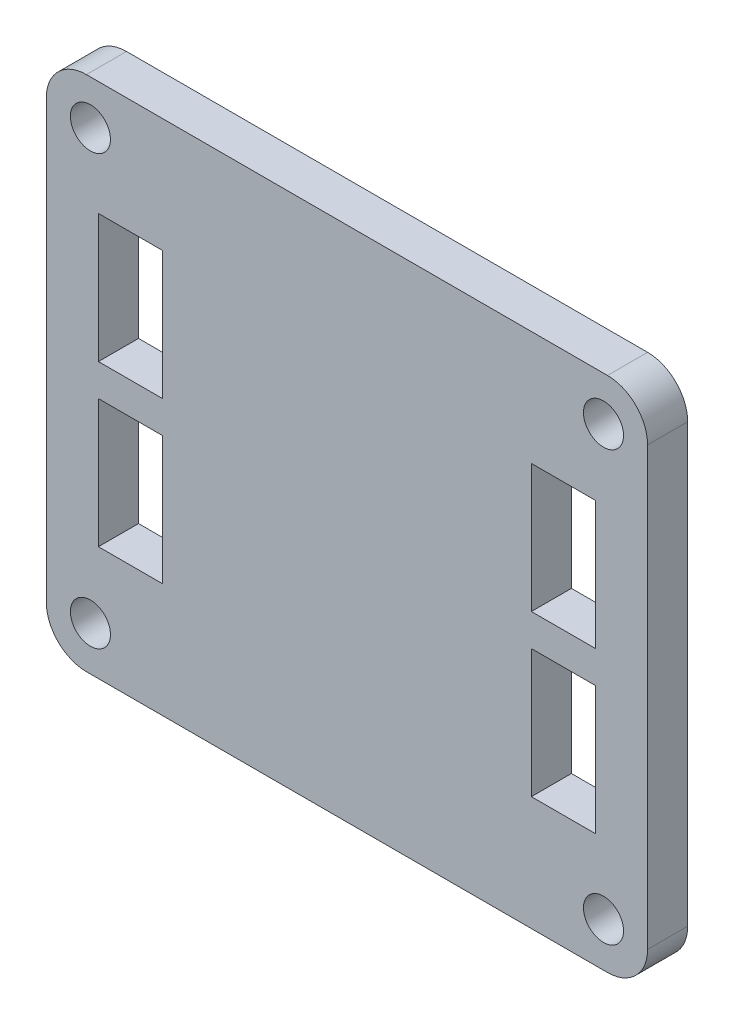
ISO-10303-21;
HEADER;
FILE_DESCRIPTION(('STEP AP214'),'2;1');
FILE_NAME('part.step','',(''),(''),'','','');
FILE_SCHEMA(('AUTOMOTIVE_DESIGN { 1 0 10303 214 1 1 1 1 }'));
ENDSEC;
DATA;
#1=APPLICATION_CONTEXT('core data for automotive mechanical design processes');
#2=APPLICATION_PROTOCOL_DEFINITION('international standard','automotive_design',2000,#1);
#3=PRODUCT_CONTEXT('',#1,'mechanical');
#4=PRODUCT('Part','Part','',(#3));
#5=PRODUCT_RELATED_PRODUCT_CATEGORY('part','',(#4));
#6=PRODUCT_DEFINITION_FORMATION('','',#4);
#7=PRODUCT_DEFINITION_CONTEXT('part definition',#1,'design');
#8=PRODUCT_DEFINITION('design','',#6,#7);
#9=PRODUCT_DEFINITION_SHAPE('','',#8);
#10=(LENGTH_UNIT() NAMED_UNIT(*) SI_UNIT(.MILLI.,.METRE.));
#11=(NAMED_UNIT(*) PLANE_ANGLE_UNIT() SI_UNIT($,.RADIAN.));
#12=(NAMED_UNIT(*) SI_UNIT($,.STERADIAN.) SOLID_ANGLE_UNIT());
#13=UNCERTAINTY_MEASURE_WITH_UNIT(LENGTH_MEASURE(1.E-05),#10,'distance_accuracy_value','');
#14=(GEOMETRIC_REPRESENTATION_CONTEXT(3) GLOBAL_UNCERTAINTY_ASSIGNED_CONTEXT((#13)) GLOBAL_UNIT_ASSIGNED_CONTEXT((#10,
#11,#12)) REPRESENTATION_CONTEXT('',''));
#15=CARTESIAN_POINT('',(0.,0.,0.));
#16=DIRECTION('',(0.,0.,1.));
#17=DIRECTION('',(1.,0.,0.));
#18=AXIS2_PLACEMENT_3D('',#15,#16,#17);
#19=CARTESIAN_POINT('',(0.,0.,0.));
#20=DIRECTION('',(0.,0.,1.));
#21=DIRECTION('',(1.,0.,0.));
#22=AXIS2_PLACEMENT_3D('',#19,#20,#21);
#23=PLANE('',#22);
#24=DIRECTION('',(-1.,0.,0.));
#25=VECTOR('',#24,1.);
#26=CARTESIAN_POINT('',(31.,-18.,0.));
#27=LINE('',#26,#25);
#28=CARTESIAN_POINT('',(31.,-18.,0.));
#29=VERTEX_POINT('',#28);
#30=CARTESIAN_POINT('',(23.,-18.,0.));
#31=VERTEX_POINT('',#30);
#32=EDGE_CURVE('E288',#29,#31,#27,.T.);
#33=ORIENTED_EDGE('',*,*,#32,.F.);
#34=DIRECTION('',(0.,-1.,0.));
#35=VECTOR('',#34,1.);
#36=CARTESIAN_POINT('',(31.,-18.,0.));
#37=LINE('',#36,#35);
#38=CARTESIAN_POINT('',(31.,-2.,0.));
#39=VERTEX_POINT('',#38);
#40=EDGE_CURVE('E286',#39,#29,#37,.T.);
#41=ORIENTED_EDGE('',*,*,#40,.F.);
#42=DIRECTION('',(1.,0.,0.));
#43=VECTOR('',#42,1.);
#44=CARTESIAN_POINT('',(31.,-2.,0.));
#45=LINE('',#44,#43);
#46=CARTESIAN_POINT('',(23.,-2.,0.));
#47=VERTEX_POINT('',#46);
#48=EDGE_CURVE('E276',#47,#39,#45,.T.);
#49=ORIENTED_EDGE('',*,*,#48,.F.);
#50=DIRECTION('',(0.,1.,0.));
#51=VECTOR('',#50,1.);
#52=CARTESIAN_POINT('',(23.,-18.,0.));
#53=LINE('',#52,#51);
#54=EDGE_CURVE('E291',#31,#47,#53,.T.);
#55=ORIENTED_EDGE('',*,*,#54,.F.);
#56=EDGE_LOOP('',(#33,#41,#49,#55));
#57=FACE_BOUND('',#56,.T.);
#58=DIRECTION('',(0.,1.,0.));
#59=VECTOR('',#58,1.);
#60=CARTESIAN_POINT('',(-31.,-18.,0.));
#61=LINE('',#60,#59);
#62=CARTESIAN_POINT('',(-31.,-18.,0.));
#63=VERTEX_POINT('',#62);
#64=CARTESIAN_POINT('',(-31.,-2.,0.));
#65=VERTEX_POINT('',#64);
#66=EDGE_CURVE('E256',#63,#65,#61,.T.);
#67=ORIENTED_EDGE('',*,*,#66,.F.);
#68=DIRECTION('',(-1.,0.,0.));
#69=VECTOR('',#68,1.);
#70=CARTESIAN_POINT('',(-31.,-18.,0.));
#71=LINE('',#70,#69);
#72=CARTESIAN_POINT('',(-23.,-18.,0.));
#73=VERTEX_POINT('',#72);
#74=EDGE_CURVE('E254',#73,#63,#71,.T.);
#75=ORIENTED_EDGE('',*,*,#74,.F.);
#76=DIRECTION('',(0.,-1.,0.));
#77=VECTOR('',#76,1.);
#78=CARTESIAN_POINT('',(-23.,-18.,0.));
#79=LINE('',#78,#77);
#80=CARTESIAN_POINT('',(-23.,-2.,0.));
#81=VERTEX_POINT('',#80);
#82=EDGE_CURVE('E244',#81,#73,#79,.T.);
#83=ORIENTED_EDGE('',*,*,#82,.F.);
#84=DIRECTION('',(1.,0.,0.));
#85=VECTOR('',#84,1.);
#86=CARTESIAN_POINT('',(-31.,-2.,0.));
#87=LINE('',#86,#85);
#88=EDGE_CURVE('E260',#65,#81,#87,.T.);
#89=ORIENTED_EDGE('',*,*,#88,.F.);
#90=EDGE_LOOP('',(#67,#75,#83,#89));
#91=FACE_BOUND('',#90,.T.);
#92=DIRECTION('',(1.,0.,0.));
#93=VECTOR('',#92,1.);
#94=CARTESIAN_POINT('',(-31.,18.,0.));
#95=LINE('',#94,#93);
#96=CARTESIAN_POINT('',(-31.,18.,0.));
#97=VERTEX_POINT('',#96);
#98=CARTESIAN_POINT('',(-23.,18.,0.));
#99=VERTEX_POINT('',#98);
#100=EDGE_CURVE('E229',#97,#99,#95,.T.);
#101=ORIENTED_EDGE('',*,*,#100,.F.);
#102=DIRECTION('',(0.,1.,0.));
#103=VECTOR('',#102,1.);
#104=CARTESIAN_POINT('',(-31.,18.,0.));
#105=LINE('',#104,#103);
#106=CARTESIAN_POINT('',(-31.,2.,0.));
#107=VERTEX_POINT('',#106);
#108=EDGE_CURVE('E202',#107,#97,#105,.T.);
#109=ORIENTED_EDGE('',*,*,#108,.F.);
#110=DIRECTION('',(-1.,0.,0.));
#111=VECTOR('',#110,1.);
#112=CARTESIAN_POINT('',(-31.,2.,0.));
#113=LINE('',#112,#111);
#114=CARTESIAN_POINT('',(-23.,2.,0.));
#115=VERTEX_POINT('',#114);
#116=EDGE_CURVE('E220',#115,#107,#113,.T.);
#117=ORIENTED_EDGE('',*,*,#116,.F.);
#118=DIRECTION('',(0.,-1.,0.));
#119=VECTOR('',#118,1.);
#120=CARTESIAN_POINT('',(-23.,18.,0.));
#121=LINE('',#120,#119);
#122=EDGE_CURVE('E223',#99,#115,#121,.T.);
#123=ORIENTED_EDGE('',*,*,#122,.F.);
#124=EDGE_LOOP('',(#101,#109,#117,#123));
#125=FACE_BOUND('',#124,.T.);
#126=DIRECTION('',(-1.,0.,0.));
#127=VECTOR('',#126,1.);
#128=CARTESIAN_POINT('',(31.,2.,0.));
#129=LINE('',#128,#127);
#130=CARTESIAN_POINT('',(31.,2.,0.));
#131=VERTEX_POINT('',#130);
#132=CARTESIAN_POINT('',(23.,2.,0.));
#133=VERTEX_POINT('',#132);
#134=EDGE_CURVE('E318',#131,#133,#129,.T.);
#135=ORIENTED_EDGE('',*,*,#134,.F.);
#136=DIRECTION('',(0.,-1.,0.));
#137=VECTOR('',#136,1.);
#138=CARTESIAN_POINT('',(31.,18.,0.));
#139=LINE('',#138,#137);
#140=CARTESIAN_POINT('',(31.,18.,0.));
#141=VERTEX_POINT('',#140);
#142=EDGE_CURVE('E236',#141,#131,#139,.T.);
#143=ORIENTED_EDGE('',*,*,#142,.F.);
#144=DIRECTION('',(1.,0.,0.));
#145=VECTOR('',#144,1.);
#146=CARTESIAN_POINT('',(31.,18.,0.));
#147=LINE('',#146,#145);
#148=CARTESIAN_POINT('',(23.,18.,0.));
#149=VERTEX_POINT('',#148);
#150=EDGE_CURVE('E307',#149,#141,#147,.T.);
#151=ORIENTED_EDGE('',*,*,#150,.F.);
#152=DIRECTION('',(0.,1.,0.));
#153=VECTOR('',#152,1.);
#154=CARTESIAN_POINT('',(23.,18.,0.));
#155=LINE('',#154,#153);
#156=EDGE_CURVE('E321',#133,#149,#155,.T.);
#157=ORIENTED_EDGE('',*,*,#156,.F.);
#158=EDGE_LOOP('',(#135,#143,#151,#157));
#159=FACE_BOUND('',#158,.T.);
#160=CARTESIAN_POINT('',(32.,26.75,0.));
#161=DIRECTION('',(0.,0.,-1.));
#162=DIRECTION('',(1.,0.,0.));
#163=AXIS2_PLACEMENT_3D('',#160,#161,#162);
#164=CIRCLE('',#163,2.5);
#165=CARTESIAN_POINT('',(34.5,26.75,0.));
#166=VERTEX_POINT('',#165);
#167=EDGE_CURVE('E328',#166,#166,#164,.T.);
#168=ORIENTED_EDGE('',*,*,#167,.F.);
#169=EDGE_LOOP('',(#168));
#170=FACE_BOUND('',#169,.T.);
#171=CARTESIAN_POINT('',(32.,-26.75,0.));
#172=DIRECTION('',(0.,0.,-1.));
#173=DIRECTION('',(-1.,0.,0.));
#174=AXIS2_PLACEMENT_3D('',#171,#172,#173);
#175=CIRCLE('',#174,2.5);
#176=CARTESIAN_POINT('',(29.5,-26.75,0.));
#177=VERTEX_POINT('',#176);
#178=EDGE_CURVE('E345',#177,#177,#175,.T.);
#179=ORIENTED_EDGE('',*,*,#178,.F.);
#180=EDGE_LOOP('',(#179));
#181=FACE_BOUND('',#180,.T.);
#182=CARTESIAN_POINT('',(-32.,-26.75,0.));
#183=DIRECTION('',(0.,0.,-1.));
#184=DIRECTION('',(1.,0.,0.));
#185=AXIS2_PLACEMENT_3D('',#182,#183,#184);
#186=CIRCLE('',#185,2.5);
#187=CARTESIAN_POINT('',(-29.5,-26.75,0.));
#188=VERTEX_POINT('',#187);
#189=EDGE_CURVE('E339',#188,#188,#186,.T.);
#190=ORIENTED_EDGE('',*,*,#189,.F.);
#191=EDGE_LOOP('',(#190));
#192=FACE_BOUND('',#191,.T.);
#193=CARTESIAN_POINT('',(-32.,26.75,0.));
#194=DIRECTION('',(0.,0.,-1.));
#195=DIRECTION('',(-1.,0.,0.));
#196=AXIS2_PLACEMENT_3D('',#193,#194,#195);
#197=CIRCLE('',#196,2.5);
#198=CARTESIAN_POINT('',(-34.5,26.75,0.));
#199=VERTEX_POINT('',#198);
#200=EDGE_CURVE('E338',#199,#199,#197,.T.);
#201=ORIENTED_EDGE('',*,*,#200,.F.);
#202=EDGE_LOOP('',(#201));
#203=FACE_BOUND('',#202,.T.);
#204=DIRECTION('',(1.,0.,0.));
#205=VECTOR('',#204,1.);
#206=CARTESIAN_POINT('',(37.5,-32.25,0.));
#207=LINE('',#206,#205);
#208=CARTESIAN_POINT('',(-32.5,-32.25,0.));
#209=VERTEX_POINT('',#208);
#210=CARTESIAN_POINT('',(32.5,-32.25,0.));
#211=VERTEX_POINT('',#210);
#212=EDGE_CURVE('E373',#209,#211,#207,.T.);
#213=ORIENTED_EDGE('',*,*,#212,.F.);
#214=CARTESIAN_POINT('',(-32.5,-27.25,0.));
#215=DIRECTION('',(0.,0.,1.));
#216=DIRECTION('',(1.,0.,0.));
#217=AXIS2_PLACEMENT_3D('',#214,#215,#216);
#218=CIRCLE('',#217,5.);
#219=CARTESIAN_POINT('',(-37.5,-27.25,0.));
#220=VERTEX_POINT('',#219);
#221=EDGE_CURVE('E390',#209,#220,#218,.F.);
#222=ORIENTED_EDGE('',*,*,#221,.T.);
#223=DIRECTION('',(0.,-1.,0.));
#224=VECTOR('',#223,1.);
#225=CARTESIAN_POINT('',(-37.5,-32.25,0.));
#226=LINE('',#225,#224);
#227=CARTESIAN_POINT('',(-37.5,27.25,0.));
#228=VERTEX_POINT('',#227);
#229=EDGE_CURVE('E356',#228,#220,#226,.T.);
#230=ORIENTED_EDGE('',*,*,#229,.F.);
#231=CARTESIAN_POINT('',(-32.5,27.25,0.));
#232=DIRECTION('',(0.,0.,1.));
#233=DIRECTION('',(1.,0.,0.));
#234=AXIS2_PLACEMENT_3D('',#231,#232,#233);
#235=CIRCLE('',#234,5.);
#236=CARTESIAN_POINT('',(-32.5,32.25,0.));
#237=VERTEX_POINT('',#236);
#238=EDGE_CURVE('E388',#228,#237,#235,.F.);
#239=ORIENTED_EDGE('',*,*,#238,.T.);
#240=DIRECTION('',(-1.,0.,0.));
#241=VECTOR('',#240,1.);
#242=CARTESIAN_POINT('',(37.5,32.25,0.));
#243=LINE('',#242,#241);
#244=CARTESIAN_POINT('',(32.5,32.25,0.));
#245=VERTEX_POINT('',#244);
#246=EDGE_CURVE('E363',#245,#237,#243,.T.);
#247=ORIENTED_EDGE('',*,*,#246,.F.);
#248=CARTESIAN_POINT('',(32.5,27.25,0.));
#249=DIRECTION('',(0.,0.,1.));
#250=DIRECTION('',(1.,0.,0.));
#251=AXIS2_PLACEMENT_3D('',#248,#249,#250);
#252=CIRCLE('',#251,5.);
#253=CARTESIAN_POINT('',(37.5,27.25,0.));
#254=VERTEX_POINT('',#253);
#255=EDGE_CURVE('E384',#245,#254,#252,.F.);
#256=ORIENTED_EDGE('',*,*,#255,.T.);
#257=DIRECTION('',(0.,1.,0.));
#258=VECTOR('',#257,1.);
#259=CARTESIAN_POINT('',(37.5,-32.25,0.));
#260=LINE('',#259,#258);
#261=CARTESIAN_POINT('',(37.5,-27.25,0.));
#262=VERTEX_POINT('',#261);
#263=EDGE_CURVE('E376',#262,#254,#260,.T.);
#264=ORIENTED_EDGE('',*,*,#263,.F.);
#265=CARTESIAN_POINT('',(32.5,-27.25,0.));
#266=DIRECTION('',(0.,0.,1.));
#267=DIRECTION('',(1.,0.,0.));
#268=AXIS2_PLACEMENT_3D('',#265,#266,#267);
#269=CIRCLE('',#268,5.);
#270=EDGE_CURVE('E386',#262,#211,#269,.F.);
#271=ORIENTED_EDGE('',*,*,#270,.T.);
#272=EDGE_LOOP('',(#213,#222,#230,#239,#247,#256,#264,#271));
#273=FACE_BOUND('',#272,.T.);
#274=ADVANCED_FACE('F32',(#57,#91,#125,#159,#170,#181,#192,#203,#273),#23,.F.);
#275=CARTESIAN_POINT('',(-37.5,-32.25,5.));
#276=DIRECTION('',(1.,0.,0.));
#277=DIRECTION('',(0.,0.,-1.));
#278=AXIS2_PLACEMENT_3D('',#275,#276,#277);
#279=PLANE('',#278);
#280=ORIENTED_EDGE('',*,*,#229,.T.);
#281=DIRECTION('',(0.,0.,-1.));
#282=VECTOR('',#281,1.);
#283=CARTESIAN_POINT('',(-37.5,-27.25,5.));
#284=LINE('',#283,#282);
#285=CARTESIAN_POINT('',(-37.5,-27.25,5.));
#286=VERTEX_POINT('',#285);
#287=EDGE_CURVE('E395',#220,#286,#284,.F.);
#288=ORIENTED_EDGE('',*,*,#287,.T.);
#289=DIRECTION('',(0.,-1.,0.));
#290=VECTOR('',#289,1.);
#291=CARTESIAN_POINT('',(-37.5,-32.25,5.));
#292=LINE('',#291,#290);
#293=CARTESIAN_POINT('',(-37.5,27.25,5.));
#294=VERTEX_POINT('',#293);
#295=EDGE_CURVE('E359',#294,#286,#292,.T.);
#296=ORIENTED_EDGE('',*,*,#295,.F.);
#297=DIRECTION('',(0.,0.,-1.));
#298=VECTOR('',#297,1.);
#299=CARTESIAN_POINT('',(-37.5,27.25,5.));
#300=LINE('',#299,#298);
#301=EDGE_CURVE('E392',#294,#228,#300,.T.);
#302=ORIENTED_EDGE('',*,*,#301,.T.);
#303=EDGE_LOOP('',(#280,#288,#296,#302));
#304=FACE_BOUND('',#303,.T.);
#305=ADVANCED_FACE('F427',(#304),#279,.F.);
#306=CARTESIAN_POINT('',(37.5,-32.25,5.));
#307=DIRECTION('',(0.,1.,0.));
#308=DIRECTION('',(0.,0.,1.));
#309=AXIS2_PLACEMENT_3D('',#306,#307,#308);
#310=PLANE('',#309);
#311=DIRECTION('',(1.,0.,0.));
#312=VECTOR('',#311,1.);
#313=CARTESIAN_POINT('',(37.5,-32.25,5.));
#314=LINE('',#313,#312);
#315=CARTESIAN_POINT('',(-32.5,-32.25,5.));
#316=VERTEX_POINT('',#315);
#317=CARTESIAN_POINT('',(32.5,-32.25,5.));
#318=VERTEX_POINT('',#317);
#319=EDGE_CURVE('E362',#316,#318,#314,.T.);
#320=ORIENTED_EDGE('',*,*,#319,.F.);
#321=DIRECTION('',(0.,0.,-1.));
#322=VECTOR('',#321,1.);
#323=CARTESIAN_POINT('',(-32.5,-32.25,5.));
#324=LINE('',#323,#322);
#325=EDGE_CURVE('E381',#316,#209,#324,.T.);
#326=ORIENTED_EDGE('',*,*,#325,.T.);
#327=ORIENTED_EDGE('',*,*,#212,.T.);
#328=DIRECTION('',(0.,0.,-1.));
#329=VECTOR('',#328,1.);
#330=CARTESIAN_POINT('',(32.5,-32.25,5.));
#331=LINE('',#330,#329);
#332=EDGE_CURVE('E370',#211,#318,#331,.F.);
#333=ORIENTED_EDGE('',*,*,#332,.T.);
#334=EDGE_LOOP('',(#320,#326,#327,#333));
#335=FACE_BOUND('',#334,.T.);
#336=ADVANCED_FACE('F435',(#335),#310,.F.);
#337=CARTESIAN_POINT('',(37.5,-32.25,5.));
#338=DIRECTION('',(-1.,0.,0.));
#339=DIRECTION('',(0.,0.,1.));
#340=AXIS2_PLACEMENT_3D('',#337,#338,#339);
#341=PLANE('',#340);
#342=DIRECTION('',(0.,1.,0.));
#343=VECTOR('',#342,1.);
#344=CARTESIAN_POINT('',(37.5,-32.25,5.));
#345=LINE('',#344,#343);
#346=CARTESIAN_POINT('',(37.5,-27.25,5.));
#347=VERTEX_POINT('',#346);
#348=CARTESIAN_POINT('',(37.5,27.25,5.));
#349=VERTEX_POINT('',#348);
#350=EDGE_CURVE('E366',#347,#349,#345,.T.);
#351=ORIENTED_EDGE('',*,*,#350,.F.);
#352=DIRECTION('',(0.,0.,-1.));
#353=VECTOR('',#352,1.);
#354=CARTESIAN_POINT('',(37.5,-27.25,5.));
#355=LINE('',#354,#353);
#356=EDGE_CURVE('E11',#347,#262,#355,.T.);
#357=ORIENTED_EDGE('',*,*,#356,.T.);
#358=ORIENTED_EDGE('',*,*,#263,.T.);
#359=DIRECTION('',(0.,0.,-1.));
#360=VECTOR('',#359,1.);
#361=CARTESIAN_POINT('',(37.5,27.25,5.));
#362=LINE('',#361,#360);
#363=EDGE_CURVE('E40',#254,#349,#362,.F.);
#364=ORIENTED_EDGE('',*,*,#363,.T.);
#365=EDGE_LOOP('',(#351,#357,#358,#364));
#366=FACE_BOUND('',#365,.T.);
#367=ADVANCED_FACE('F410',(#366),#341,.F.);
#368=CARTESIAN_POINT('',(37.5,32.25,5.));
#369=DIRECTION('',(0.,-1.,0.));
#370=DIRECTION('',(0.,0.,-1.));
#371=AXIS2_PLACEMENT_3D('',#368,#369,#370);
#372=PLANE('',#371);
#373=ORIENTED_EDGE('',*,*,#246,.T.);
#374=DIRECTION('',(0.,0.,-1.));
#375=VECTOR('',#374,1.);
#376=CARTESIAN_POINT('',(-32.5,32.25,5.));
#377=LINE('',#376,#375);
#378=CARTESIAN_POINT('',(-32.5,32.25,5.));
#379=VERTEX_POINT('',#378);
#380=EDGE_CURVE('E47',#237,#379,#377,.F.);
#381=ORIENTED_EDGE('',*,*,#380,.T.);
#382=DIRECTION('',(-1.,0.,0.));
#383=VECTOR('',#382,1.);
#384=CARTESIAN_POINT('',(37.5,32.25,5.));
#385=LINE('',#384,#383);
#386=CARTESIAN_POINT('',(32.5,32.25,5.));
#387=VERTEX_POINT('',#386);
#388=EDGE_CURVE('E368',#387,#379,#385,.T.);
#389=ORIENTED_EDGE('',*,*,#388,.F.);
#390=DIRECTION('',(0.,0.,-1.));
#391=VECTOR('',#390,1.);
#392=CARTESIAN_POINT('',(32.5,32.25,5.));
#393=LINE('',#392,#391);
#394=EDGE_CURVE('E404',#387,#245,#393,.T.);
#395=ORIENTED_EDGE('',*,*,#394,.T.);
#396=EDGE_LOOP('',(#373,#381,#389,#395));
#397=FACE_BOUND('',#396,.T.);
#398=ADVANCED_FACE('F417',(#397),#372,.F.);
#399=CARTESIAN_POINT('',(0.,0.,5.));
#400=DIRECTION('',(0.,0.,1.));
#401=DIRECTION('',(1.,0.,0.));
#402=AXIS2_PLACEMENT_3D('',#399,#400,#401);
#403=PLANE('',#402);
#404=DIRECTION('',(0.,-1.,0.));
#405=VECTOR('',#404,1.);
#406=CARTESIAN_POINT('',(31.,-18.,5.));
#407=LINE('',#406,#405);
#408=CARTESIAN_POINT('',(31.,-2.,5.));
#409=VERTEX_POINT('',#408);
#410=CARTESIAN_POINT('',(31.,-18.,5.));
#411=VERTEX_POINT('',#410);
#412=EDGE_CURVE('E272',#409,#411,#407,.T.);
#413=ORIENTED_EDGE('',*,*,#412,.T.);
#414=DIRECTION('',(-1.,0.,0.));
#415=VECTOR('',#414,1.);
#416=CARTESIAN_POINT('',(31.,-18.,5.));
#417=LINE('',#416,#415);
#418=CARTESIAN_POINT('',(23.,-18.,5.));
#419=VERTEX_POINT('',#418);
#420=EDGE_CURVE('E275',#411,#419,#417,.T.);
#421=ORIENTED_EDGE('',*,*,#420,.T.);
#422=DIRECTION('',(0.,1.,0.));
#423=VECTOR('',#422,1.);
#424=CARTESIAN_POINT('',(23.,-18.,5.));
#425=LINE('',#424,#423);
#426=CARTESIAN_POINT('',(23.,-2.,5.));
#427=VERTEX_POINT('',#426);
#428=EDGE_CURVE('E279',#419,#427,#425,.T.);
#429=ORIENTED_EDGE('',*,*,#428,.T.);
#430=DIRECTION('',(1.,0.,0.));
#431=VECTOR('',#430,1.);
#432=CARTESIAN_POINT('',(31.,-2.,5.));
#433=LINE('',#432,#431);
#434=EDGE_CURVE('E282',#427,#409,#433,.T.);
#435=ORIENTED_EDGE('',*,*,#434,.T.);
#436=EDGE_LOOP('',(#413,#421,#429,#435));
#437=FACE_BOUND('',#436,.T.);
#438=DIRECTION('',(-1.,0.,0.));
#439=VECTOR('',#438,1.);
#440=CARTESIAN_POINT('',(-31.,-18.,5.));
#441=LINE('',#440,#439);
#442=CARTESIAN_POINT('',(-23.,-18.,5.));
#443=VERTEX_POINT('',#442);
#444=CARTESIAN_POINT('',(-31.,-18.,5.));
#445=VERTEX_POINT('',#444);
#446=EDGE_CURVE('E240',#443,#445,#441,.T.);
#447=ORIENTED_EDGE('',*,*,#446,.T.);
#448=DIRECTION('',(0.,1.,0.));
#449=VECTOR('',#448,1.);
#450=CARTESIAN_POINT('',(-31.,-18.,5.));
#451=LINE('',#450,#449);
#452=CARTESIAN_POINT('',(-31.,-2.,5.));
#453=VERTEX_POINT('',#452);
#454=EDGE_CURVE('E243',#445,#453,#451,.T.);
#455=ORIENTED_EDGE('',*,*,#454,.T.);
#456=DIRECTION('',(1.,0.,0.));
#457=VECTOR('',#456,1.);
#458=CARTESIAN_POINT('',(-31.,-2.,5.));
#459=LINE('',#458,#457);
#460=CARTESIAN_POINT('',(-23.,-2.,5.));
#461=VERTEX_POINT('',#460);
#462=EDGE_CURVE('E247',#453,#461,#459,.T.);
#463=ORIENTED_EDGE('',*,*,#462,.T.);
#464=DIRECTION('',(0.,-1.,0.));
#465=VECTOR('',#464,1.);
#466=CARTESIAN_POINT('',(-23.,-18.,5.));
#467=LINE('',#466,#465);
#468=EDGE_CURVE('E250',#461,#443,#467,.T.);
#469=ORIENTED_EDGE('',*,*,#468,.T.);
#470=EDGE_LOOP('',(#447,#455,#463,#469));
#471=FACE_BOUND('',#470,.T.);
#472=DIRECTION('',(0.,1.,0.));
#473=VECTOR('',#472,1.);
#474=CARTESIAN_POINT('',(-31.,18.,5.));
#475=LINE('',#474,#473);
#476=CARTESIAN_POINT('',(-31.,2.,5.));
#477=VERTEX_POINT('',#476);
#478=CARTESIAN_POINT('',(-31.,18.,5.));
#479=VERTEX_POINT('',#478);
#480=EDGE_CURVE('E199',#477,#479,#475,.T.);
#481=ORIENTED_EDGE('',*,*,#480,.T.);
#482=DIRECTION('',(1.,0.,0.));
#483=VECTOR('',#482,1.);
#484=CARTESIAN_POINT('',(-31.,18.,5.));
#485=LINE('',#484,#483);
#486=CARTESIAN_POINT('',(-23.,18.,5.));
#487=VERTEX_POINT('',#486);
#488=EDGE_CURVE('E211',#479,#487,#485,.T.);
#489=ORIENTED_EDGE('',*,*,#488,.T.);
#490=DIRECTION('',(0.,-1.,0.));
#491=VECTOR('',#490,1.);
#492=CARTESIAN_POINT('',(-23.,18.,5.));
#493=LINE('',#492,#491);
#494=CARTESIAN_POINT('',(-23.,2.,5.));
#495=VERTEX_POINT('',#494);
#496=EDGE_CURVE('E215',#487,#495,#493,.T.);
#497=ORIENTED_EDGE('',*,*,#496,.T.);
#498=DIRECTION('',(-1.,0.,0.));
#499=VECTOR('',#498,1.);
#500=CARTESIAN_POINT('',(-31.,2.,5.));
#501=LINE('',#500,#499);
#502=EDGE_CURVE('E207',#495,#477,#501,.T.);
#503=ORIENTED_EDGE('',*,*,#502,.T.);
#504=EDGE_LOOP('',(#481,#489,#497,#503));
#505=FACE_BOUND('',#504,.T.);
#506=DIRECTION('',(0.,-1.,0.));
#507=VECTOR('',#506,1.);
#508=CARTESIAN_POINT('',(31.,18.,5.));
#509=LINE('',#508,#507);
#510=CARTESIAN_POINT('',(31.,18.,5.));
#511=VERTEX_POINT('',#510);
#512=CARTESIAN_POINT('',(31.,2.,5.));
#513=VERTEX_POINT('',#512);
#514=EDGE_CURVE('E303',#511,#513,#509,.T.);
#515=ORIENTED_EDGE('',*,*,#514,.T.);
#516=DIRECTION('',(-1.,0.,0.));
#517=VECTOR('',#516,1.);
#518=CARTESIAN_POINT('',(31.,2.,5.));
#519=LINE('',#518,#517);
#520=CARTESIAN_POINT('',(23.,2.,5.));
#521=VERTEX_POINT('',#520);
#522=EDGE_CURVE('E306',#513,#521,#519,.T.);
#523=ORIENTED_EDGE('',*,*,#522,.T.);
#524=DIRECTION('',(0.,1.,0.));
#525=VECTOR('',#524,1.);
#526=CARTESIAN_POINT('',(23.,18.,5.));
#527=LINE('',#526,#525);
#528=CARTESIAN_POINT('',(23.,18.,5.));
#529=VERTEX_POINT('',#528);
#530=EDGE_CURVE('E310',#521,#529,#527,.T.);
#531=ORIENTED_EDGE('',*,*,#530,.T.);
#532=DIRECTION('',(1.,0.,0.));
#533=VECTOR('',#532,1.);
#534=CARTESIAN_POINT('',(31.,18.,5.));
#535=LINE('',#534,#533);
#536=EDGE_CURVE('E313',#529,#511,#535,.T.);
#537=ORIENTED_EDGE('',*,*,#536,.T.);
#538=EDGE_LOOP('',(#515,#523,#531,#537));
#539=FACE_BOUND('',#538,.T.);
#540=CARTESIAN_POINT('',(32.,26.75,5.));
#541=DIRECTION('',(0.,0.,-1.));
#542=DIRECTION('',(1.,0.,0.));
#543=AXIS2_PLACEMENT_3D('',#540,#541,#542);
#544=CIRCLE('',#543,2.5);
#545=CARTESIAN_POINT('',(34.5,26.75,5.));
#546=VERTEX_POINT('',#545);
#547=EDGE_CURVE('E348',#546,#546,#544,.T.);
#548=ORIENTED_EDGE('',*,*,#547,.T.);
#549=EDGE_LOOP('',(#548));
#550=FACE_BOUND('',#549,.T.);
#551=CARTESIAN_POINT('',(32.,-26.75,5.));
#552=DIRECTION('',(0.,0.,-1.));
#553=DIRECTION('',(-1.,0.,0.));
#554=AXIS2_PLACEMENT_3D('',#551,#552,#553);
#555=CIRCLE('',#554,2.5);
#556=CARTESIAN_POINT('',(29.5,-26.75,5.));
#557=VERTEX_POINT('',#556);
#558=EDGE_CURVE('E342',#557,#557,#555,.T.);
#559=ORIENTED_EDGE('',*,*,#558,.T.);
#560=EDGE_LOOP('',(#559));
#561=FACE_BOUND('',#560,.T.);
#562=CARTESIAN_POINT('',(-32.,-26.75,5.));
#563=DIRECTION('',(0.,0.,-1.));
#564=DIRECTION('',(1.,0.,0.));
#565=AXIS2_PLACEMENT_3D('',#562,#563,#564);
#566=CIRCLE('',#565,2.5);
#567=CARTESIAN_POINT('',(-29.5,-26.75,5.));
#568=VERTEX_POINT('',#567);
#569=EDGE_CURVE('E335',#568,#568,#566,.T.);
#570=ORIENTED_EDGE('',*,*,#569,.T.);
#571=EDGE_LOOP('',(#570));
#572=FACE_BOUND('',#571,.T.);
#573=CARTESIAN_POINT('',(-32.,26.75,5.));
#574=DIRECTION('',(0.,0.,-1.));
#575=DIRECTION('',(-1.,0.,0.));
#576=AXIS2_PLACEMENT_3D('',#573,#574,#575);
#577=CIRCLE('',#576,2.5);
#578=CARTESIAN_POINT('',(-34.5,26.75,5.));
#579=VERTEX_POINT('',#578);
#580=EDGE_CURVE('E353',#579,#579,#577,.T.);
#581=ORIENTED_EDGE('',*,*,#580,.T.);
#582=EDGE_LOOP('',(#581));
#583=FACE_BOUND('',#582,.T.);
#584=ORIENTED_EDGE('',*,*,#295,.T.);
#585=CARTESIAN_POINT('',(-32.5,-27.25,5.));
#586=DIRECTION('',(0.,0.,1.));
#587=DIRECTION('',(1.,0.,0.));
#588=AXIS2_PLACEMENT_3D('',#585,#586,#587);
#589=CIRCLE('',#588,5.);
#590=EDGE_CURVE('E402',#286,#316,#589,.T.);
#591=ORIENTED_EDGE('',*,*,#590,.T.);
#592=ORIENTED_EDGE('',*,*,#319,.T.);
#593=CARTESIAN_POINT('',(32.5,-27.25,5.));
#594=DIRECTION('',(0.,0.,1.));
#595=DIRECTION('',(1.,0.,0.));
#596=AXIS2_PLACEMENT_3D('',#593,#594,#595);
#597=CIRCLE('',#596,5.);
#598=EDGE_CURVE('E398',#318,#347,#597,.T.);
#599=ORIENTED_EDGE('',*,*,#598,.T.);
#600=ORIENTED_EDGE('',*,*,#350,.T.);
#601=CARTESIAN_POINT('',(32.5,27.25,5.));
#602=DIRECTION('',(0.,0.,1.));
#603=DIRECTION('',(1.,0.,0.));
#604=AXIS2_PLACEMENT_3D('',#601,#602,#603);
#605=CIRCLE('',#604,5.);
#606=EDGE_CURVE('E54',#349,#387,#605,.T.);
#607=ORIENTED_EDGE('',*,*,#606,.T.);
#608=ORIENTED_EDGE('',*,*,#388,.T.);
#609=CARTESIAN_POINT('',(-32.5,27.25,5.));
#610=DIRECTION('',(0.,0.,1.));
#611=DIRECTION('',(1.,0.,0.));
#612=AXIS2_PLACEMENT_3D('',#609,#610,#611);
#613=CIRCLE('',#612,5.);
#614=EDGE_CURVE('E400',#379,#294,#613,.T.);
#615=ORIENTED_EDGE('',*,*,#614,.T.);
#616=EDGE_LOOP('',(#584,#591,#592,#599,#600,#607,#608,#615));
#617=FACE_BOUND('',#616,.T.);
#618=ADVANCED_FACE('F217',(#437,#471,#505,#539,#550,#561,#572,#583,#617),#403,.T.);
#619=CARTESIAN_POINT('',(-32.,26.75,5.));
#620=DIRECTION('',(0.,0.,-1.));
#621=DIRECTION('',(-1.,0.,0.));
#622=AXIS2_PLACEMENT_3D('',#619,#620,#621);
#623=CYLINDRICAL_SURFACE('',#622,2.5);
#624=ORIENTED_EDGE('',*,*,#580,.F.);
#625=EDGE_LOOP('',(#624));
#626=FACE_BOUND('',#625,.T.);
#627=ORIENTED_EDGE('',*,*,#200,.T.);
#628=EDGE_LOOP('',(#627));
#629=FACE_BOUND('',#628,.T.);
#630=ADVANCED_FACE('F505',(#626,#629),#623,.F.);
#631=CARTESIAN_POINT('',(-32.,-26.75,5.));
#632=DIRECTION('',(0.,0.,-1.));
#633=DIRECTION('',(-1.,0.,0.));
#634=AXIS2_PLACEMENT_3D('',#631,#632,#633);
#635=CYLINDRICAL_SURFACE('',#634,2.5);
#636=ORIENTED_EDGE('',*,*,#569,.F.);
#637=EDGE_LOOP('',(#636));
#638=FACE_BOUND('',#637,.T.);
#639=ORIENTED_EDGE('',*,*,#189,.T.);
#640=EDGE_LOOP('',(#639));
#641=FACE_BOUND('',#640,.T.);
#642=ADVANCED_FACE('F501',(#638,#641),#635,.F.);
#643=CARTESIAN_POINT('',(32.,-26.75,5.));
#644=DIRECTION('',(0.,0.,-1.));
#645=DIRECTION('',(-1.,0.,0.));
#646=AXIS2_PLACEMENT_3D('',#643,#644,#645);
#647=CYLINDRICAL_SURFACE('',#646,2.5);
#648=ORIENTED_EDGE('',*,*,#558,.F.);
#649=EDGE_LOOP('',(#648));
#650=FACE_BOUND('',#649,.T.);
#651=ORIENTED_EDGE('',*,*,#178,.T.);
#652=EDGE_LOOP('',(#651));
#653=FACE_BOUND('',#652,.T.);
#654=ADVANCED_FACE('F504',(#650,#653),#647,.F.);
#655=CARTESIAN_POINT('',(32.,26.75,5.));
#656=DIRECTION('',(0.,0.,-1.));
#657=DIRECTION('',(-1.,0.,0.));
#658=AXIS2_PLACEMENT_3D('',#655,#656,#657);
#659=CYLINDRICAL_SURFACE('',#658,2.5);
#660=ORIENTED_EDGE('',*,*,#547,.F.);
#661=EDGE_LOOP('',(#660));
#662=FACE_BOUND('',#661,.T.);
#663=ORIENTED_EDGE('',*,*,#167,.T.);
#664=EDGE_LOOP('',(#663));
#665=FACE_BOUND('',#664,.T.);
#666=ADVANCED_FACE('F499',(#662,#665),#659,.F.);
#667=CARTESIAN_POINT('',(31.,18.,5.));
#668=DIRECTION('',(1.,0.,0.));
#669=DIRECTION('',(0.,0.,-1.));
#670=AXIS2_PLACEMENT_3D('',#667,#668,#669);
#671=PLANE('',#670);
#672=ORIENTED_EDGE('',*,*,#142,.T.);
#673=DIRECTION('',(0.,0.,-1.));
#674=VECTOR('',#673,1.);
#675=CARTESIAN_POINT('',(31.,2.,5.));
#676=LINE('',#675,#674);
#677=EDGE_CURVE('E316',#513,#131,#676,.T.);
#678=ORIENTED_EDGE('',*,*,#677,.F.);
#679=ORIENTED_EDGE('',*,*,#514,.F.);
#680=DIRECTION('',(0.,0.,-1.));
#681=VECTOR('',#680,1.);
#682=CARTESIAN_POINT('',(31.,18.,5.));
#683=LINE('',#682,#681);
#684=EDGE_CURVE('E326',#511,#141,#683,.T.);
#685=ORIENTED_EDGE('',*,*,#684,.T.);
#686=EDGE_LOOP('',(#672,#678,#679,#685));
#687=FACE_BOUND('',#686,.T.);
#688=ADVANCED_FACE('F488',(#687),#671,.F.);
#689=CARTESIAN_POINT('',(31.,18.,5.));
#690=DIRECTION('',(0.,1.,0.));
#691=DIRECTION('',(-1.,0.,0.));
#692=AXIS2_PLACEMENT_3D('',#689,#690,#691);
#693=PLANE('',#692);
#694=ORIENTED_EDGE('',*,*,#150,.T.);
#695=ORIENTED_EDGE('',*,*,#684,.F.);
#696=ORIENTED_EDGE('',*,*,#536,.F.);
#697=DIRECTION('',(0.,0.,-1.));
#698=VECTOR('',#697,1.);
#699=CARTESIAN_POINT('',(23.,18.,5.));
#700=LINE('',#699,#698);
#701=EDGE_CURVE('E329',#529,#149,#700,.T.);
#702=ORIENTED_EDGE('',*,*,#701,.T.);
#703=EDGE_LOOP('',(#694,#695,#696,#702));
#704=FACE_BOUND('',#703,.T.);
#705=ADVANCED_FACE('F484',(#704),#693,.F.);
#706=CARTESIAN_POINT('',(23.,18.,5.));
#707=DIRECTION('',(-1.,0.,0.));
#708=DIRECTION('',(0.,0.,1.));
#709=AXIS2_PLACEMENT_3D('',#706,#707,#708);
#710=PLANE('',#709);
#711=ORIENTED_EDGE('',*,*,#156,.T.);
#712=ORIENTED_EDGE('',*,*,#701,.F.);
#713=ORIENTED_EDGE('',*,*,#530,.F.);
#714=DIRECTION('',(0.,0.,-1.));
#715=VECTOR('',#714,1.);
#716=CARTESIAN_POINT('',(23.,2.,5.));
#717=LINE('',#716,#715);
#718=EDGE_CURVE('E331',#521,#133,#717,.T.);
#719=ORIENTED_EDGE('',*,*,#718,.T.);
#720=EDGE_LOOP('',(#711,#712,#713,#719));
#721=FACE_BOUND('',#720,.T.);
#722=ADVANCED_FACE('F487',(#721),#710,.F.);
#723=CARTESIAN_POINT('',(31.,2.,5.));
#724=DIRECTION('',(0.,-1.,0.));
#725=DIRECTION('',(0.,0.,-1.));
#726=AXIS2_PLACEMENT_3D('',#723,#724,#725);
#727=PLANE('',#726);
#728=ORIENTED_EDGE('',*,*,#134,.T.);
#729=ORIENTED_EDGE('',*,*,#718,.F.);
#730=ORIENTED_EDGE('',*,*,#522,.F.);
#731=ORIENTED_EDGE('',*,*,#677,.T.);
#732=EDGE_LOOP('',(#728,#729,#730,#731));
#733=FACE_BOUND('',#732,.T.);
#734=ADVANCED_FACE('F492',(#733),#727,.F.);
#735=CARTESIAN_POINT('',(-31.,18.,5.));
#736=DIRECTION('',(-1.,0.,0.));
#737=DIRECTION('',(0.,0.,1.));
#738=AXIS2_PLACEMENT_3D('',#735,#736,#737);
#739=PLANE('',#738);
#740=ORIENTED_EDGE('',*,*,#108,.T.);
#741=DIRECTION('',(0.,0.,-1.));
#742=VECTOR('',#741,1.);
#743=CARTESIAN_POINT('',(-31.,18.,5.));
#744=LINE('',#743,#742);
#745=EDGE_CURVE('E195',#479,#97,#744,.T.);
#746=ORIENTED_EDGE('',*,*,#745,.F.);
#747=ORIENTED_EDGE('',*,*,#480,.F.);
#748=DIRECTION('',(0.,0.,-1.));
#749=VECTOR('',#748,1.);
#750=CARTESIAN_POINT('',(-31.,2.,5.));
#751=LINE('',#750,#749);
#752=EDGE_CURVE('E234',#477,#107,#751,.T.);
#753=ORIENTED_EDGE('',*,*,#752,.T.);
#754=EDGE_LOOP('',(#740,#746,#747,#753));
#755=FACE_BOUND('',#754,.T.);
#756=ADVANCED_FACE('F197',(#755),#739,.F.);
#757=CARTESIAN_POINT('',(-31.,2.,5.));
#758=DIRECTION('',(0.,-1.,0.));
#759=DIRECTION('',(0.,0.,-1.));
#760=AXIS2_PLACEMENT_3D('',#757,#758,#759);
#761=PLANE('',#760);
#762=ORIENTED_EDGE('',*,*,#116,.T.);
#763=ORIENTED_EDGE('',*,*,#752,.F.);
#764=ORIENTED_EDGE('',*,*,#502,.F.);
#765=DIRECTION('',(0.,0.,-1.));
#766=VECTOR('',#765,1.);
#767=CARTESIAN_POINT('',(-23.,2.,5.));
#768=LINE('',#767,#766);
#769=EDGE_CURVE('E237',#495,#115,#768,.T.);
#770=ORIENTED_EDGE('',*,*,#769,.T.);
#771=EDGE_LOOP('',(#762,#763,#764,#770));
#772=FACE_BOUND('',#771,.T.);
#773=ADVANCED_FACE('F572',(#772),#761,.F.);
#774=CARTESIAN_POINT('',(-23.,18.,5.));
#775=DIRECTION('',(1.,0.,0.));
#776=DIRECTION('',(0.,0.,-1.));
#777=AXIS2_PLACEMENT_3D('',#774,#775,#776);
#778=PLANE('',#777);
#779=ORIENTED_EDGE('',*,*,#122,.T.);
#780=ORIENTED_EDGE('',*,*,#769,.F.);
#781=ORIENTED_EDGE('',*,*,#496,.F.);
#782=DIRECTION('',(0.,0.,-1.));
#783=VECTOR('',#782,1.);
#784=CARTESIAN_POINT('',(-23.,18.,5.));
#785=LINE('',#784,#783);
#786=EDGE_CURVE('E206',#487,#99,#785,.T.);
#787=ORIENTED_EDGE('',*,*,#786,.T.);
#788=EDGE_LOOP('',(#779,#780,#781,#787));
#789=FACE_BOUND('',#788,.T.);
#790=ADVANCED_FACE('F570',(#789),#778,.F.);
#791=CARTESIAN_POINT('',(-31.,18.,5.));
#792=DIRECTION('',(0.,1.,0.));
#793=DIRECTION('',(-1.,0.,0.));
#794=AXIS2_PLACEMENT_3D('',#791,#792,#793);
#795=PLANE('',#794);
#796=ORIENTED_EDGE('',*,*,#100,.T.);
#797=ORIENTED_EDGE('',*,*,#786,.F.);
#798=ORIENTED_EDGE('',*,*,#488,.F.);
#799=ORIENTED_EDGE('',*,*,#745,.T.);
#800=EDGE_LOOP('',(#796,#797,#798,#799));
#801=FACE_BOUND('',#800,.T.);
#802=ADVANCED_FACE('F212',(#801),#795,.F.);
#803=CARTESIAN_POINT('',(-31.,-18.,5.));
#804=DIRECTION('',(0.,-1.,0.));
#805=DIRECTION('',(1.,0.,0.));
#806=AXIS2_PLACEMENT_3D('',#803,#804,#805);
#807=PLANE('',#806);
#808=ORIENTED_EDGE('',*,*,#74,.T.);
#809=DIRECTION('',(0.,0.,-1.));
#810=VECTOR('',#809,1.);
#811=CARTESIAN_POINT('',(-31.,-18.,5.));
#812=LINE('',#811,#810);
#813=EDGE_CURVE('E253',#445,#63,#812,.T.);
#814=ORIENTED_EDGE('',*,*,#813,.F.);
#815=ORIENTED_EDGE('',*,*,#446,.F.);
#816=DIRECTION('',(0.,0.,-1.));
#817=VECTOR('',#816,1.);
#818=CARTESIAN_POINT('',(-23.,-18.,5.));
#819=LINE('',#818,#817);
#820=EDGE_CURVE('E230',#443,#73,#819,.T.);
#821=ORIENTED_EDGE('',*,*,#820,.T.);
#822=EDGE_LOOP('',(#808,#814,#815,#821));
#823=FACE_BOUND('',#822,.T.);
#824=ADVANCED_FACE('F531',(#823),#807,.F.);
#825=CARTESIAN_POINT('',(-23.,-18.,5.));
#826=DIRECTION('',(1.,0.,0.));
#827=DIRECTION('',(0.,0.,-1.));
#828=AXIS2_PLACEMENT_3D('',#825,#826,#827);
#829=PLANE('',#828);
#830=ORIENTED_EDGE('',*,*,#82,.T.);
#831=ORIENTED_EDGE('',*,*,#820,.F.);
#832=ORIENTED_EDGE('',*,*,#468,.F.);
#833=DIRECTION('',(0.,0.,-1.));
#834=VECTOR('',#833,1.);
#835=CARTESIAN_POINT('',(-23.,-2.,5.));
#836=LINE('',#835,#834);
#837=EDGE_CURVE('E266',#461,#81,#836,.T.);
#838=ORIENTED_EDGE('',*,*,#837,.T.);
#839=EDGE_LOOP('',(#830,#831,#832,#838));
#840=FACE_BOUND('',#839,.T.);
#841=ADVANCED_FACE('F541',(#840),#829,.F.);
#842=CARTESIAN_POINT('',(-31.,-2.,5.));
#843=DIRECTION('',(0.,1.,0.));
#844=DIRECTION('',(0.,0.,1.));
#845=AXIS2_PLACEMENT_3D('',#842,#843,#844);
#846=PLANE('',#845);
#847=ORIENTED_EDGE('',*,*,#88,.T.);
#848=ORIENTED_EDGE('',*,*,#837,.F.);
#849=ORIENTED_EDGE('',*,*,#462,.F.);
#850=DIRECTION('',(0.,0.,-1.));
#851=VECTOR('',#850,1.);
#852=CARTESIAN_POINT('',(-31.,-2.,5.));
#853=LINE('',#852,#851);
#854=EDGE_CURVE('E268',#453,#65,#853,.T.);
#855=ORIENTED_EDGE('',*,*,#854,.T.);
#856=EDGE_LOOP('',(#847,#848,#849,#855));
#857=FACE_BOUND('',#856,.T.);
#858=ADVANCED_FACE('F538',(#857),#846,.F.);
#859=CARTESIAN_POINT('',(-31.,-18.,5.));
#860=DIRECTION('',(-1.,0.,0.));
#861=DIRECTION('',(0.,0.,1.));
#862=AXIS2_PLACEMENT_3D('',#859,#860,#861);
#863=PLANE('',#862);
#864=ORIENTED_EDGE('',*,*,#66,.T.);
#865=ORIENTED_EDGE('',*,*,#854,.F.);
#866=ORIENTED_EDGE('',*,*,#454,.F.);
#867=ORIENTED_EDGE('',*,*,#813,.T.);
#868=EDGE_LOOP('',(#864,#865,#866,#867));
#869=FACE_BOUND('',#868,.T.);
#870=ADVANCED_FACE('F482',(#869),#863,.F.);
#871=CARTESIAN_POINT('',(31.,-18.,5.));
#872=DIRECTION('',(1.,0.,0.));
#873=DIRECTION('',(0.,0.,-1.));
#874=AXIS2_PLACEMENT_3D('',#871,#872,#873);
#875=PLANE('',#874);
#876=ORIENTED_EDGE('',*,*,#40,.T.);
#877=DIRECTION('',(0.,0.,-1.));
#878=VECTOR('',#877,1.);
#879=CARTESIAN_POINT('',(31.,-18.,5.));
#880=LINE('',#879,#878);
#881=EDGE_CURVE('E285',#411,#29,#880,.T.);
#882=ORIENTED_EDGE('',*,*,#881,.F.);
#883=ORIENTED_EDGE('',*,*,#412,.F.);
#884=DIRECTION('',(0.,0.,-1.));
#885=VECTOR('',#884,1.);
#886=CARTESIAN_POINT('',(31.,-2.,5.));
#887=LINE('',#886,#885);
#888=EDGE_CURVE('E257',#409,#39,#887,.T.);
#889=ORIENTED_EDGE('',*,*,#888,.T.);
#890=EDGE_LOOP('',(#876,#882,#883,#889));
#891=FACE_BOUND('',#890,.T.);
#892=ADVANCED_FACE('F479',(#891),#875,.F.);
#893=CARTESIAN_POINT('',(31.,-2.,5.));
#894=DIRECTION('',(0.,1.,0.));
#895=DIRECTION('',(0.,0.,1.));
#896=AXIS2_PLACEMENT_3D('',#893,#894,#895);
#897=PLANE('',#896);
#898=ORIENTED_EDGE('',*,*,#48,.T.);
#899=ORIENTED_EDGE('',*,*,#888,.F.);
#900=ORIENTED_EDGE('',*,*,#434,.F.);
#901=DIRECTION('',(0.,0.,-1.));
#902=VECTOR('',#901,1.);
#903=CARTESIAN_POINT('',(23.,-2.,5.));
#904=LINE('',#903,#902);
#905=EDGE_CURVE('E297',#427,#47,#904,.T.);
#906=ORIENTED_EDGE('',*,*,#905,.T.);
#907=EDGE_LOOP('',(#898,#899,#900,#906));
#908=FACE_BOUND('',#907,.T.);
#909=ADVANCED_FACE('F474',(#908),#897,.F.);
#910=CARTESIAN_POINT('',(23.,-18.,5.));
#911=DIRECTION('',(-1.,0.,0.));
#912=DIRECTION('',(0.,0.,1.));
#913=AXIS2_PLACEMENT_3D('',#910,#911,#912);
#914=PLANE('',#913);
#915=ORIENTED_EDGE('',*,*,#54,.T.);
#916=ORIENTED_EDGE('',*,*,#905,.F.);
#917=ORIENTED_EDGE('',*,*,#428,.F.);
#918=DIRECTION('',(0.,0.,-1.));
#919=VECTOR('',#918,1.);
#920=CARTESIAN_POINT('',(23.,-18.,5.));
#921=LINE('',#920,#919);
#922=EDGE_CURVE('E299',#419,#31,#921,.T.);
#923=ORIENTED_EDGE('',*,*,#922,.T.);
#924=EDGE_LOOP('',(#915,#916,#917,#923));
#925=FACE_BOUND('',#924,.T.);
#926=ADVANCED_FACE('F468',(#925),#914,.F.);
#927=CARTESIAN_POINT('',(31.,-18.,5.));
#928=DIRECTION('',(0.,-1.,0.));
#929=DIRECTION('',(1.,0.,0.));
#930=AXIS2_PLACEMENT_3D('',#927,#928,#929);
#931=PLANE('',#930);
#932=ORIENTED_EDGE('',*,*,#32,.T.);
#933=ORIENTED_EDGE('',*,*,#922,.F.);
#934=ORIENTED_EDGE('',*,*,#420,.F.);
#935=ORIENTED_EDGE('',*,*,#881,.T.);
#936=EDGE_LOOP('',(#932,#933,#934,#935));
#937=FACE_BOUND('',#936,.T.);
#938=ADVANCED_FACE('F464',(#937),#931,.F.);
#939=CARTESIAN_POINT('',(-32.5,-27.25,5.));
#940=DIRECTION('',(0.,0.,-1.));
#941=DIRECTION('',(-1.,0.,0.));
#942=AXIS2_PLACEMENT_3D('',#939,#940,#941);
#943=CYLINDRICAL_SURFACE('',#942,5.);
#944=ORIENTED_EDGE('',*,*,#590,.F.);
#945=ORIENTED_EDGE('',*,*,#287,.F.);
#946=ORIENTED_EDGE('',*,*,#221,.F.);
#947=ORIENTED_EDGE('',*,*,#325,.F.);
#948=EDGE_LOOP('',(#944,#945,#946,#947));
#949=FACE_BOUND('',#948,.T.);
#950=ADVANCED_FACE('F433',(#949),#943,.T.);
#951=CARTESIAN_POINT('',(-32.5,27.25,5.));
#952=DIRECTION('',(0.,0.,-1.));
#953=DIRECTION('',(-1.,0.,0.));
#954=AXIS2_PLACEMENT_3D('',#951,#952,#953);
#955=CYLINDRICAL_SURFACE('',#954,5.);
#956=ORIENTED_EDGE('',*,*,#614,.F.);
#957=ORIENTED_EDGE('',*,*,#380,.F.);
#958=ORIENTED_EDGE('',*,*,#238,.F.);
#959=ORIENTED_EDGE('',*,*,#301,.F.);
#960=EDGE_LOOP('',(#956,#957,#958,#959));
#961=FACE_BOUND('',#960,.T.);
#962=ADVANCED_FACE('F424',(#961),#955,.T.);
#963=CARTESIAN_POINT('',(32.5,-27.25,5.));
#964=DIRECTION('',(0.,0.,-1.));
#965=DIRECTION('',(-1.,0.,0.));
#966=AXIS2_PLACEMENT_3D('',#963,#964,#965);
#967=CYLINDRICAL_SURFACE('',#966,5.);
#968=ORIENTED_EDGE('',*,*,#598,.F.);
#969=ORIENTED_EDGE('',*,*,#332,.F.);
#970=ORIENTED_EDGE('',*,*,#270,.F.);
#971=ORIENTED_EDGE('',*,*,#356,.F.);
#972=EDGE_LOOP('',(#968,#969,#970,#971));
#973=FACE_BOUND('',#972,.T.);
#974=ADVANCED_FACE('F438',(#973),#967,.T.);
#975=CARTESIAN_POINT('',(32.5,27.25,5.));
#976=DIRECTION('',(0.,0.,-1.));
#977=DIRECTION('',(-1.,0.,0.));
#978=AXIS2_PLACEMENT_3D('',#975,#976,#977);
#979=CYLINDRICAL_SURFACE('',#978,5.);
#980=ORIENTED_EDGE('',*,*,#606,.F.);
#981=ORIENTED_EDGE('',*,*,#363,.F.);
#982=ORIENTED_EDGE('',*,*,#255,.F.);
#983=ORIENTED_EDGE('',*,*,#394,.F.);
#984=EDGE_LOOP('',(#980,#981,#982,#983));
#985=FACE_BOUND('',#984,.T.);
#986=ADVANCED_FACE('F34',(#985),#979,.T.);
#987=CLOSED_SHELL('',(#274,#305,#336,#367,#398,#618,#630,#642,#654,#666,#688,#705,#722,#734,
#756,#773,#790,#802,#824,#841,#858,#870,#892,#909,#926,#938,#950,#962,#974,#986));
#988=MANIFOLD_SOLID_BREP('B2',#987);
#989=ADVANCED_BREP_SHAPE_REPRESENTATION('',(#18,#988),#14);
#990=SHAPE_DEFINITION_REPRESENTATION(#9,#989);
ENDSEC;
END-ISO-10303-21;
